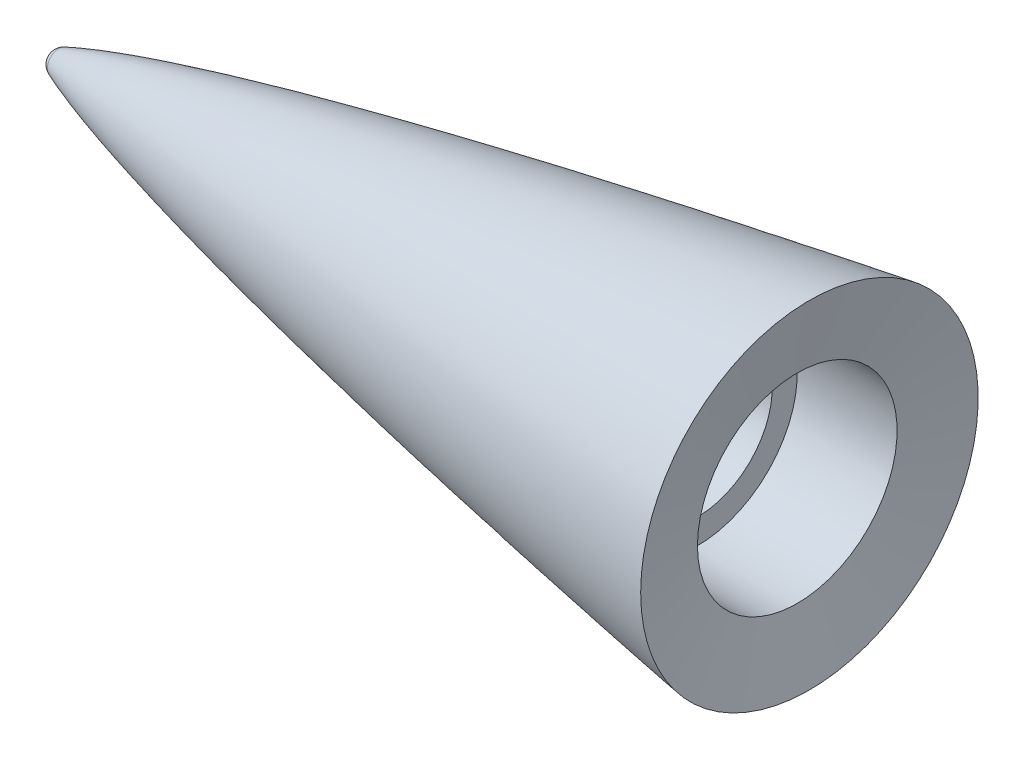
ISO-10303-21;
HEADER;
FILE_DESCRIPTION(('STEP AP214'),'2;1');
FILE_NAME('part.step','',(''),(''),'','','');
FILE_SCHEMA(('AUTOMOTIVE_DESIGN { 1 0 10303 214 1 1 1 1 }'));
ENDSEC;
DATA;
#1=APPLICATION_CONTEXT('core data for automotive mechanical design processes');
#2=APPLICATION_PROTOCOL_DEFINITION('international standard','automotive_design',2000,#1);
#3=PRODUCT_CONTEXT('',#1,'mechanical');
#4=PRODUCT('Part','Part','',(#3));
#5=PRODUCT_RELATED_PRODUCT_CATEGORY('part','',(#4));
#6=PRODUCT_DEFINITION_FORMATION('','',#4);
#7=PRODUCT_DEFINITION_CONTEXT('part definition',#1,'design');
#8=PRODUCT_DEFINITION('design','',#6,#7);
#9=PRODUCT_DEFINITION_SHAPE('','',#8);
#10=(LENGTH_UNIT() NAMED_UNIT(*) SI_UNIT(.MILLI.,.METRE.));
#11=(NAMED_UNIT(*) PLANE_ANGLE_UNIT() SI_UNIT($,.RADIAN.));
#12=(NAMED_UNIT(*) SI_UNIT($,.STERADIAN.) SOLID_ANGLE_UNIT());
#13=UNCERTAINTY_MEASURE_WITH_UNIT(LENGTH_MEASURE(1.E-05),#10,'distance_accuracy_value','');
#14=(GEOMETRIC_REPRESENTATION_CONTEXT(3) GLOBAL_UNCERTAINTY_ASSIGNED_CONTEXT((#13)) GLOBAL_UNIT_ASSIGNED_CONTEXT((#10,
#11,#12)) REPRESENTATION_CONTEXT('',''));
#15=CARTESIAN_POINT('',(0.,0.,0.));
#16=DIRECTION('',(0.,0.,1.));
#17=DIRECTION('',(1.,0.,0.));
#18=AXIS2_PLACEMENT_3D('',#15,#16,#17);
#19=CARTESIAN_POINT('',(83.9194053924837,0.,-12.6999999999991));
#20=DIRECTION('',(-1.,0.,0.));
#21=DIRECTION('',(0.,0.,1.));
#22=AXIS2_PLACEMENT_3D('',#19,#20,#21);
#23=PLANE('',#22);
#24=CARTESIAN_POINT('',(83.9194053924837,0.,0.));
#25=DIRECTION('',(-1.,0.,0.));
#26=DIRECTION('',(0.,0.,1.));
#27=AXIS2_PLACEMENT_3D('',#24,#25,#26);
#28=CIRCLE('',#27,12.6999999999991);
#29=CARTESIAN_POINT('',(83.9194053924837,0.,12.6999999999991));
#30=VERTEX_POINT('',#29);
#31=EDGE_CURVE('E10',#30,#30,#28,.T.);
#32=ORIENTED_EDGE('',*,*,#31,.F.);
#33=EDGE_LOOP('',(#32));
#34=FACE_BOUND('',#33,.T.);
#35=CARTESIAN_POINT('',(83.9194053924837,0.,0.));
#36=DIRECTION('',(-1.,0.,0.));
#37=DIRECTION('',(0.,0.,1.));
#38=AXIS2_PLACEMENT_3D('',#35,#36,#37);
#39=CIRCLE('',#38,9.525);
#40=CARTESIAN_POINT('',(83.9194053924837,0.,9.525));
#41=VERTEX_POINT('',#40);
#42=EDGE_CURVE('E59',#41,#41,#39,.T.);
#43=ORIENTED_EDGE('',*,*,#42,.T.);
#44=EDGE_LOOP('',(#43));
#45=FACE_BOUND('',#44,.T.);
#46=ADVANCED_FACE('F31',(#34,#45),#23,.F.);
#47=CARTESIAN_POINT('',(0.,0.,0.));
#48=DIRECTION('',(-1.,0.,0.));
#49=DIRECTION('',(0.,0.,1.));
#50=AXIS2_PLACEMENT_3D('',#47,#48,#49);
#51=CYLINDRICAL_SURFACE('',#50,12.6999999999991);
#52=CARTESIAN_POINT('',(96.6194053924837,0.,0.));
#53=DIRECTION('',(-1.,0.,0.));
#54=DIRECTION('',(0.,0.,1.));
#55=AXIS2_PLACEMENT_3D('',#52,#53,#54);
#56=CIRCLE('',#55,12.6999999999991);
#57=CARTESIAN_POINT('',(96.6194053924837,0.,12.6999999999991));
#58=VERTEX_POINT('',#57);
#59=EDGE_CURVE('E37',#58,#58,#56,.T.);
#60=ORIENTED_EDGE('',*,*,#59,.F.);
#61=EDGE_LOOP('',(#60));
#62=FACE_BOUND('',#61,.T.);
#63=ORIENTED_EDGE('',*,*,#31,.T.);
#64=EDGE_LOOP('',(#63));
#65=FACE_BOUND('',#64,.T.);
#66=ADVANCED_FACE('F78',(#62,#65),#51,.F.);
#67=CARTESIAN_POINT('',(96.6194053924837,0.,0.));
#68=DIRECTION('',(1.,0.,0.));
#69=DIRECTION('',(0.,0.,-1.));
#70=AXIS2_PLACEMENT_3D('',#67,#68,#69);
#71=CONICAL_SURFACE('',#70,12.6999999999991,1.39626340127259);
#72=CARTESIAN_POINT('',(98.1654285821485,0.,0.));
#73=DIRECTION('',(-1.,0.,0.));
#74=DIRECTION('',(0.,0.,1.));
#75=AXIS2_PLACEMENT_3D('',#72,#73,#74);
#76=CIRCLE('',#75,21.4679331916985);
#77=CARTESIAN_POINT('',(98.1654285821485,0.,21.4679331916985));
#78=VERTEX_POINT('',#77);
#79=EDGE_CURVE('E41',#78,#78,#76,.T.);
#80=ORIENTED_EDGE('',*,*,#79,.F.);
#81=EDGE_LOOP('',(#80));
#82=FACE_BOUND('',#81,.T.);
#83=ORIENTED_EDGE('',*,*,#59,.T.);
#84=EDGE_LOOP('',(#83));
#85=FACE_BOUND('',#84,.T.);
#86=ADVANCED_FACE('F74',(#82,#85),#71,.F.);
#87=CARTESIAN_POINT('',(98.1654285821485,0.,-21.4679331916985));
#88=CARTESIAN_POINT('',(98.1649634915861,0.,-21.4678588449137));
#89=CARTESIAN_POINT('',(97.3333723486658,0.,-21.3349250189398));
#90=CARTESIAN_POINT('',(95.6643282605228,0.,-21.0670430360847));
#91=CARTESIAN_POINT('',(92.4583875897154,0.,-20.5496454295419));
#92=CARTESIAN_POINT('',(89.1687402481209,0.,-20.01035749334));
#93=CARTESIAN_POINT('',(85.3070651026785,0.,-19.3724410882181));
#94=CARTESIAN_POINT('',(81.7849613772071,0.,-18.7812835294238));
#95=CARTESIAN_POINT('',(78.0654253465569,0.,-18.1506618123487));
#96=CARTESIAN_POINT('',(74.4590688039419,0.,-17.529825957153));
#97=CARTESIAN_POINT('',(69.8838967805536,0.,-16.7320623592298));
#98=CARTESIAN_POINT('',(64.433980883078,0.,-15.762645369331));
#99=CARTESIAN_POINT('',(58.0581539205274,0.,-14.599266319204));
#100=CARTESIAN_POINT('',(50.7937769881176,0.,-13.2269844957505));
#101=CARTESIAN_POINT('',(43.5319010479667,0.,-11.8011118443972));
#102=CARTESIAN_POINT('',(36.2869207738544,0.,-10.3137447182511));
#103=CARTESIAN_POINT('',(29.0553638889182,0.,-8.74917784058436));
#104=CARTESIAN_POINT('',(21.8473172630035,0.,-7.08667894424691));
#105=CARTESIAN_POINT('',(15.352608070185,0.,-5.45893404606891));
#106=CARTESIAN_POINT('',(9.95928520495974,0.,-3.96140285403248));
#107=CARTESIAN_POINT('',(6.07554274337049,0.,-2.73558534633698));
#108=CARTESIAN_POINT('',(3.98276576439901,0.,-1.9869769134092));
#109=CARTESIAN_POINT('',(2.98209212709341,0.,-1.59174228338597));
#110=CARTESIAN_POINT('',(2.6821271482991,0.,-1.46864436178422));
#111=B_SPLINE_CURVE_WITH_KNOTS('',4,(#87,#88,#89,#90,#91,#92,#93,#94,#95,#96,#97,#98,#99,#100,
#101,#102,#103,#104,#105,#106,#107,#108,#109,#110),.UNSPECIFIED.,.F.,.F.,(5,1,1,1,1,1,1,1,1,1,1,
1,1,1,1,1,1,1,1,1,5),(0.0278472915358386,0.0278659926055488,0.0612851050735214,
0.094704217541494,0.128123330738682,0.16154244393587,0.194961556447984,0.228380668960099,
0.261799782409213,0.295218895858327,0.362057120379041,0.428895345790999,0.495733571811468,
0.562571797597793,0.62941002206483,0.696248245183518,0.763086473220116,0.82992469326892,
0.871354334931753,0.898515123135337,0.910233153346342),.UNSPECIFIED.);
#112=CARTESIAN_POINT('',(0.,0.,0.));
#113=DIRECTION('',(-1.,0.,0.));
#114=AXIS1_PLACEMENT('',#112,#113);
#115=SURFACE_OF_REVOLUTION('',#111,#114);
#116=CARTESIAN_POINT('',(2.68212714828624,0.,0.));
#117=DIRECTION('',(-1.,0.,0.));
#118=DIRECTION('',(0.,0.,1.));
#119=AXIS2_PLACEMENT_3D('',#116,#117,#118);
#120=CIRCLE('',#119,1.46864436177894);
#121=CARTESIAN_POINT('',(2.68212714828624,0.,1.46864436177894));
#122=VERTEX_POINT('',#121);
#123=EDGE_CURVE('E45',#122,#122,#120,.T.);
#124=ORIENTED_EDGE('',*,*,#123,.F.);
#125=EDGE_LOOP('',(#124));
#126=FACE_BOUND('',#125,.T.);
#127=ORIENTED_EDGE('',*,*,#79,.T.);
#128=EDGE_LOOP('',(#127));
#129=FACE_BOUND('',#128,.T.);
#130=ADVANCED_FACE('F69',(#126,#129),#115,.T.);
#131=CARTESIAN_POINT('',(3.28482109112482,0.,-4.06408847547501E-11));
#132=DIRECTION('',(-1.,0.,0.));
#133=DIRECTION('',(0.,0.,-1.));
#134=AXIS2_PLACEMENT_3D('',#131,#132,#133);
#135=SPHERICAL_SURFACE('',#134,1.5875);
#136=ORIENTED_EDGE('',*,*,#123,.T.);
#137=EDGE_LOOP('',(#136));
#138=FACE_BOUND('',#137,.T.);
#139=ADVANCED_FACE('F73',(#138),#135,.T.);
#140=CARTESIAN_POINT('',(39.4694053924837,0.,0.));
#141=DIRECTION('',(-1.,0.,0.));
#142=DIRECTION('',(0.,0.,1.));
#143=AXIS2_PLACEMENT_3D('',#140,#141,#142);
#144=PLANE('',#143);
#145=CARTESIAN_POINT('',(39.4694053924837,0.,0.));
#146=DIRECTION('',(-1.,0.,0.));
#147=DIRECTION('',(0.,0.,1.));
#148=AXIS2_PLACEMENT_3D('',#145,#146,#147);
#149=CIRCLE('',#148,6.35);
#150=CARTESIAN_POINT('',(39.4694053924837,0.,6.35));
#151=VERTEX_POINT('',#150);
#152=EDGE_CURVE('E50',#151,#151,#149,.T.);
#153=ORIENTED_EDGE('',*,*,#152,.F.);
#154=EDGE_LOOP('',(#153));
#155=FACE_BOUND('',#154,.T.);
#156=ADVANCED_FACE('F106',(#155),#144,.F.);
#157=CARTESIAN_POINT('',(0.,0.,0.));
#158=DIRECTION('',(-1.,0.,0.));
#159=DIRECTION('',(0.,0.,1.));
#160=AXIS2_PLACEMENT_3D('',#157,#158,#159);
#161=CYLINDRICAL_SURFACE('',#160,6.35);
#162=CARTESIAN_POINT('',(58.5194053924837,0.,0.));
#163=DIRECTION('',(-1.,0.,0.));
#164=DIRECTION('',(0.,0.,1.));
#165=AXIS2_PLACEMENT_3D('',#162,#163,#164);
#166=CIRCLE('',#165,6.35);
#167=CARTESIAN_POINT('',(58.5194053924837,0.,6.35));
#168=VERTEX_POINT('',#167);
#169=EDGE_CURVE('E53',#168,#168,#166,.T.);
#170=ORIENTED_EDGE('',*,*,#169,.F.);
#171=EDGE_LOOP('',(#170));
#172=FACE_BOUND('',#171,.T.);
#173=ORIENTED_EDGE('',*,*,#152,.T.);
#174=EDGE_LOOP('',(#173));
#175=FACE_BOUND('',#174,.T.);
#176=ADVANCED_FACE('F100',(#172,#175),#161,.F.);
#177=CARTESIAN_POINT('',(58.5194053924837,0.,-9.525));
#178=DIRECTION('',(-1.,0.,0.));
#179=DIRECTION('',(0.,0.,1.));
#180=AXIS2_PLACEMENT_3D('',#177,#178,#179);
#181=PLANE('',#180);
#182=CARTESIAN_POINT('',(58.5194053924837,0.,0.));
#183=DIRECTION('',(-1.,0.,0.));
#184=DIRECTION('',(0.,0.,1.));
#185=AXIS2_PLACEMENT_3D('',#182,#183,#184);
#186=CIRCLE('',#185,9.525);
#187=CARTESIAN_POINT('',(58.5194053924837,0.,9.525));
#188=VERTEX_POINT('',#187);
#189=EDGE_CURVE('E56',#188,#188,#186,.T.);
#190=ORIENTED_EDGE('',*,*,#189,.F.);
#191=EDGE_LOOP('',(#190));
#192=FACE_BOUND('',#191,.T.);
#193=ORIENTED_EDGE('',*,*,#169,.T.);
#194=EDGE_LOOP('',(#193));
#195=FACE_BOUND('',#194,.T.);
#196=ADVANCED_FACE('F94',(#192,#195),#181,.F.);
#197=CARTESIAN_POINT('',(0.,0.,0.));
#198=DIRECTION('',(-1.,0.,0.));
#199=DIRECTION('',(0.,0.,1.));
#200=AXIS2_PLACEMENT_3D('',#197,#198,#199);
#201=CYLINDRICAL_SURFACE('',#200,9.525);
#202=ORIENTED_EDGE('',*,*,#42,.F.);
#203=EDGE_LOOP('',(#202));
#204=FACE_BOUND('',#203,.T.);
#205=ORIENTED_EDGE('',*,*,#189,.T.);
#206=EDGE_LOOP('',(#205));
#207=FACE_BOUND('',#206,.T.);
#208=ADVANCED_FACE('F91',(#204,#207),#201,.F.);
#209=CLOSED_SHELL('',(#46,#66,#86,#130,#139,#156,#176,#196,#208));
#210=MANIFOLD_SOLID_BREP('B2',#209);
#211=ADVANCED_BREP_SHAPE_REPRESENTATION('',(#18,#210),#14);
#212=SHAPE_DEFINITION_REPRESENTATION(#9,#211);
ENDSEC;
END-ISO-10303-21;
